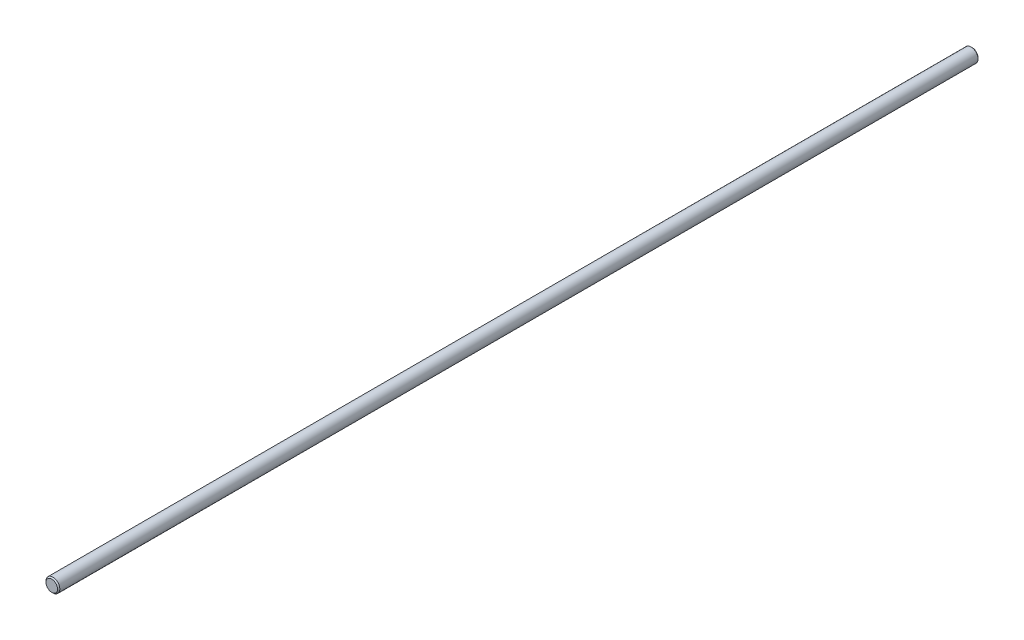
ISO-10303-21;
HEADER;
FILE_DESCRIPTION(('STEP AP214'),'2;1');
FILE_NAME('part.step','',(''),(''),'','','');
FILE_SCHEMA(('AUTOMOTIVE_DESIGN { 1 0 10303 214 1 1 1 1 }'));
ENDSEC;
DATA;
#1=APPLICATION_CONTEXT('core data for automotive mechanical design processes');
#2=APPLICATION_PROTOCOL_DEFINITION('international standard','automotive_design',2000,#1);
#3=PRODUCT_CONTEXT('',#1,'mechanical');
#4=PRODUCT('Part','Part','',(#3));
#5=PRODUCT_RELATED_PRODUCT_CATEGORY('part','',(#4));
#6=PRODUCT_DEFINITION_FORMATION('','',#4);
#7=PRODUCT_DEFINITION_CONTEXT('part definition',#1,'design');
#8=PRODUCT_DEFINITION('design','',#6,#7);
#9=PRODUCT_DEFINITION_SHAPE('','',#8);
#10=(LENGTH_UNIT() NAMED_UNIT(*) SI_UNIT(.MILLI.,.METRE.));
#11=(NAMED_UNIT(*) PLANE_ANGLE_UNIT() SI_UNIT($,.RADIAN.));
#12=(NAMED_UNIT(*) SI_UNIT($,.STERADIAN.) SOLID_ANGLE_UNIT());
#13=UNCERTAINTY_MEASURE_WITH_UNIT(LENGTH_MEASURE(1.E-05),#10,'distance_accuracy_value','');
#14=(GEOMETRIC_REPRESENTATION_CONTEXT(3) GLOBAL_UNCERTAINTY_ASSIGNED_CONTEXT((#13)) GLOBAL_UNIT_ASSIGNED_CONTEXT((#10,
#11,#12)) REPRESENTATION_CONTEXT('',''));
#15=CARTESIAN_POINT('',(0.,0.,0.));
#16=DIRECTION('',(0.,0.,1.));
#17=DIRECTION('',(1.,0.,0.));
#18=AXIS2_PLACEMENT_3D('',#15,#16,#17);
#19=CARTESIAN_POINT('',(0.,0.,200.));
#20=DIRECTION('',(0.,0.,-1.));
#21=DIRECTION('',(-1.,0.,0.));
#22=AXIS2_PLACEMENT_3D('',#19,#20,#21);
#23=CYLINDRICAL_SURFACE('',#22,3.);
#24=CARTESIAN_POINT('',(0.,0.,199.5));
#25=DIRECTION('',(0.,0.,1.));
#26=DIRECTION('',(1.,0.,0.));
#27=AXIS2_PLACEMENT_3D('',#24,#25,#26);
#28=CIRCLE('',#27,3.);
#29=CARTESIAN_POINT('',(3.,0.,199.5));
#30=VERTEX_POINT('',#29);
#31=EDGE_CURVE('E54',#30,#30,#28,.F.);
#32=ORIENTED_EDGE('',*,*,#31,.T.);
#33=EDGE_LOOP('',(#32));
#34=FACE_BOUND('',#33,.T.);
#35=CARTESIAN_POINT('',(0.,0.,-199.5));
#36=DIRECTION('',(0.,0.,1.));
#37=DIRECTION('',(1.,0.,0.));
#38=AXIS2_PLACEMENT_3D('',#35,#36,#37);
#39=CIRCLE('',#38,3.);
#40=CARTESIAN_POINT('',(3.,0.,-199.5));
#41=VERTEX_POINT('',#40);
#42=EDGE_CURVE('E59',#41,#41,#39,.T.);
#43=ORIENTED_EDGE('',*,*,#42,.T.);
#44=EDGE_LOOP('',(#43));
#45=FACE_BOUND('',#44,.T.);
#46=ADVANCED_FACE('F45',(#34,#45),#23,.T.);
#47=CARTESIAN_POINT('',(0.,0.,200.));
#48=DIRECTION('',(0.,0.,1.));
#49=DIRECTION('',(1.,0.,0.));
#50=AXIS2_PLACEMENT_3D('',#47,#48,#49);
#51=PLANE('',#50);
#52=CARTESIAN_POINT('',(0.,0.,200.));
#53=DIRECTION('',(0.,0.,1.));
#54=DIRECTION('',(1.,0.,0.));
#55=AXIS2_PLACEMENT_3D('',#52,#53,#54);
#56=CIRCLE('',#55,2.5);
#57=CARTESIAN_POINT('',(2.5,0.,200.));
#58=VERTEX_POINT('',#57);
#59=EDGE_CURVE('E64',#58,#58,#56,.T.);
#60=ORIENTED_EDGE('',*,*,#59,.T.);
#61=EDGE_LOOP('',(#60));
#62=FACE_BOUND('',#61,.T.);
#63=ADVANCED_FACE('F71',(#62),#51,.T.);
#64=CARTESIAN_POINT('',(0.,0.,-200.));
#65=DIRECTION('',(0.,0.,1.));
#66=DIRECTION('',(1.,0.,0.));
#67=AXIS2_PLACEMENT_3D('',#64,#65,#66);
#68=PLANE('',#67);
#69=CARTESIAN_POINT('',(0.,0.,-200.));
#70=DIRECTION('',(0.,0.,1.));
#71=DIRECTION('',(1.,0.,0.));
#72=AXIS2_PLACEMENT_3D('',#69,#70,#71);
#73=CIRCLE('',#72,2.5);
#74=CARTESIAN_POINT('',(2.5,0.,-200.));
#75=VERTEX_POINT('',#74);
#76=EDGE_CURVE('E10',#75,#75,#73,.F.);
#77=ORIENTED_EDGE('',*,*,#76,.T.);
#78=EDGE_LOOP('',(#77));
#79=FACE_BOUND('',#78,.T.);
#80=ADVANCED_FACE('F75',(#79),#68,.F.);
#81=CARTESIAN_POINT('',(0.,0.,200.));
#82=DIRECTION('',(0.,0.,-1.));
#83=DIRECTION('',(-1.,0.,0.));
#84=AXIS2_PLACEMENT_3D('',#81,#82,#83);
#85=CONICAL_SURFACE('',#84,2.5,0.785398163397391);
#86=ORIENTED_EDGE('',*,*,#31,.F.);
#87=EDGE_LOOP('',(#86));
#88=FACE_BOUND('',#87,.T.);
#89=ORIENTED_EDGE('',*,*,#59,.F.);
#90=EDGE_LOOP('',(#89));
#91=FACE_BOUND('',#90,.T.);
#92=ADVANCED_FACE('F73',(#88,#91),#85,.T.);
#93=CARTESIAN_POINT('',(0.,0.,-199.5));
#94=DIRECTION('',(0.,0.,1.));
#95=DIRECTION('',(1.,0.,0.));
#96=AXIS2_PLACEMENT_3D('',#93,#94,#95);
#97=CONICAL_SURFACE('',#96,3.,0.785398163397446);
#98=ORIENTED_EDGE('',*,*,#76,.F.);
#99=EDGE_LOOP('',(#98));
#100=FACE_BOUND('',#99,.T.);
#101=ORIENTED_EDGE('',*,*,#42,.F.);
#102=EDGE_LOOP('',(#101));
#103=FACE_BOUND('',#102,.T.);
#104=ADVANCED_FACE('F48',(#100,#103),#97,.T.);
#105=CLOSED_SHELL('',(#46,#63,#80,#92,#104));
#106=MANIFOLD_SOLID_BREP('B2',#105);
#107=ADVANCED_BREP_SHAPE_REPRESENTATION('',(#18,#106),#14);
#108=SHAPE_DEFINITION_REPRESENTATION(#9,#107);
ENDSEC;
END-ISO-10303-21;
